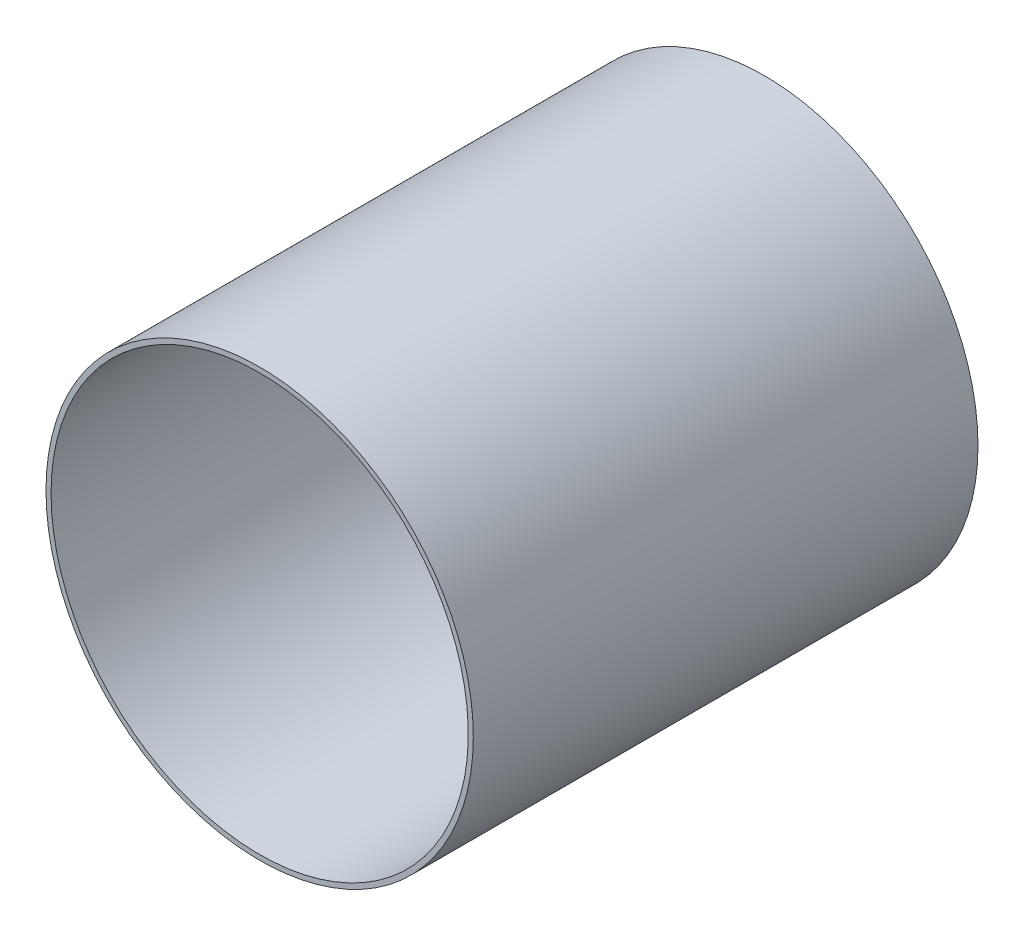
ISO-10303-21;
HEADER;
FILE_DESCRIPTION(('STEP AP214'),'2;1');
FILE_NAME('part.step','',(''),(''),'','','');
FILE_SCHEMA(('AUTOMOTIVE_DESIGN { 1 0 10303 214 1 1 1 1 }'));
ENDSEC;
DATA;
#1=APPLICATION_CONTEXT('core data for automotive mechanical design processes');
#2=APPLICATION_PROTOCOL_DEFINITION('international standard','automotive_design',2000,#1);
#3=PRODUCT_CONTEXT('',#1,'mechanical');
#4=PRODUCT('Part','Part','',(#3));
#5=PRODUCT_RELATED_PRODUCT_CATEGORY('part','',(#4));
#6=PRODUCT_DEFINITION_FORMATION('','',#4);
#7=PRODUCT_DEFINITION_CONTEXT('part definition',#1,'design');
#8=PRODUCT_DEFINITION('design','',#6,#7);
#9=PRODUCT_DEFINITION_SHAPE('','',#8);
#10=(LENGTH_UNIT() NAMED_UNIT(*) SI_UNIT(.MILLI.,.METRE.));
#11=(NAMED_UNIT(*) PLANE_ANGLE_UNIT() SI_UNIT($,.RADIAN.));
#12=(NAMED_UNIT(*) SI_UNIT($,.STERADIAN.) SOLID_ANGLE_UNIT());
#13=UNCERTAINTY_MEASURE_WITH_UNIT(LENGTH_MEASURE(1.E-05),#10,'distance_accuracy_value','');
#14=(GEOMETRIC_REPRESENTATION_CONTEXT(3) GLOBAL_UNCERTAINTY_ASSIGNED_CONTEXT((#13)) GLOBAL_UNIT_ASSIGNED_CONTEXT((#10,
#11,#12)) REPRESENTATION_CONTEXT('',''));
#15=CARTESIAN_POINT('',(0.,0.,0.));
#16=DIRECTION('',(0.,0.,1.));
#17=DIRECTION('',(1.,0.,0.));
#18=AXIS2_PLACEMENT_3D('',#15,#16,#17);
#19=CARTESIAN_POINT('',(0.,0.,76.2));
#20=DIRECTION('',(0.,0.,1.));
#21=DIRECTION('',(1.,0.,0.));
#22=AXIS2_PLACEMENT_3D('',#19,#20,#21);
#23=PLANE('',#22);
#24=CARTESIAN_POINT('',(0.,0.,76.2));
#25=DIRECTION('',(0.,0.,1.));
#26=DIRECTION('',(1.,0.,0.));
#27=AXIS2_PLACEMENT_3D('',#24,#25,#26);
#28=CIRCLE('',#27,32.258);
#29=CARTESIAN_POINT('',(-32.258,0.,76.2));
#30=VERTEX_POINT('',#29);
#31=EDGE_CURVE('E10',#30,#30,#28,.T.);
#32=ORIENTED_EDGE('',*,*,#31,.T.);
#33=EDGE_LOOP('',(#32));
#34=FACE_BOUND('',#33,.T.);
#35=CARTESIAN_POINT('',(0.,0.,76.2));
#36=DIRECTION('',(0.,0.,1.));
#37=DIRECTION('',(1.,0.,0.));
#38=AXIS2_PLACEMENT_3D('',#35,#36,#37);
#39=CIRCLE('',#38,31.5);
#40=CARTESIAN_POINT('',(-31.5,0.,76.2));
#41=VERTEX_POINT('',#40);
#42=EDGE_CURVE('E52',#41,#41,#39,.T.);
#43=ORIENTED_EDGE('',*,*,#42,.F.);
#44=EDGE_LOOP('',(#43));
#45=FACE_BOUND('',#44,.T.);
#46=ADVANCED_FACE('F39',(#34,#45),#23,.T.);
#47=CARTESIAN_POINT('',(0.,0.,0.));
#48=DIRECTION('',(0.,0.,1.));
#49=DIRECTION('',(1.,0.,0.));
#50=AXIS2_PLACEMENT_3D('',#47,#48,#49);
#51=PLANE('',#50);
#52=CARTESIAN_POINT('',(0.,0.,0.));
#53=DIRECTION('',(0.,0.,1.));
#54=DIRECTION('',(1.,0.,0.));
#55=AXIS2_PLACEMENT_3D('',#52,#53,#54);
#56=CIRCLE('',#55,32.258);
#57=CARTESIAN_POINT('',(-32.258,0.,0.));
#58=VERTEX_POINT('',#57);
#59=EDGE_CURVE('E43',#58,#58,#56,.T.);
#60=ORIENTED_EDGE('',*,*,#59,.F.);
#61=EDGE_LOOP('',(#60));
#62=FACE_BOUND('',#61,.T.);
#63=CARTESIAN_POINT('',(0.,0.,0.));
#64=DIRECTION('',(0.,0.,1.));
#65=DIRECTION('',(1.,0.,0.));
#66=AXIS2_PLACEMENT_3D('',#63,#64,#65);
#67=CIRCLE('',#66,31.5);
#68=CARTESIAN_POINT('',(-31.5,0.,0.));
#69=VERTEX_POINT('',#68);
#70=EDGE_CURVE('E54',#69,#69,#67,.T.);
#71=ORIENTED_EDGE('',*,*,#70,.T.);
#72=EDGE_LOOP('',(#71));
#73=FACE_BOUND('',#72,.T.);
#74=ADVANCED_FACE('F66',(#62,#73),#51,.F.);
#75=CARTESIAN_POINT('',(0.,0.,76.2));
#76=DIRECTION('',(0.,0.,-1.));
#77=DIRECTION('',(-1.,0.,0.));
#78=AXIS2_PLACEMENT_3D('',#75,#76,#77);
#79=CYLINDRICAL_SURFACE('',#78,32.258);
#80=CARTESIAN_POINT('',(-32.258,0.,76.2));
#81=CARTESIAN_POINT('',(-32.258,0.,75.40625));
#82=CARTESIAN_POINT('',(-32.258,0.,74.6125));
#83=CARTESIAN_POINT('',(-32.258,0.,73.025));
#84=CARTESIAN_POINT('',(-32.258,0.,72.23125));
#85=CARTESIAN_POINT('',(-32.258,0.,70.64375));
#86=CARTESIAN_POINT('',(-32.258,0.,69.85));
#87=CARTESIAN_POINT('',(-32.258,0.,68.2625));
#88=CARTESIAN_POINT('',(-32.258,0.,67.46875));
#89=CARTESIAN_POINT('',(-32.258,0.,65.88125));
#90=CARTESIAN_POINT('',(-32.258,0.,65.0875));
#91=CARTESIAN_POINT('',(-32.258,0.,63.5));
#92=CARTESIAN_POINT('',(-32.258,0.,62.70625));
#93=CARTESIAN_POINT('',(-32.258,0.,61.11875));
#94=CARTESIAN_POINT('',(-32.258,0.,60.325));
#95=CARTESIAN_POINT('',(-32.258,0.,58.7375));
#96=CARTESIAN_POINT('',(-32.258,0.,57.94375));
#97=CARTESIAN_POINT('',(-32.258,0.,56.35625));
#98=CARTESIAN_POINT('',(-32.258,0.,55.5625));
#99=CARTESIAN_POINT('',(-32.258,0.,53.975));
#100=CARTESIAN_POINT('',(-32.258,0.,53.18125));
#101=CARTESIAN_POINT('',(-32.258,0.,51.59375));
#102=CARTESIAN_POINT('',(-32.258,0.,50.8));
#103=CARTESIAN_POINT('',(-32.258,0.,49.2125));
#104=CARTESIAN_POINT('',(-32.258,0.,48.41875));
#105=CARTESIAN_POINT('',(-32.258,0.,46.83125));
#106=CARTESIAN_POINT('',(-32.258,0.,46.0375));
#107=CARTESIAN_POINT('',(-32.258,0.,44.45));
#108=CARTESIAN_POINT('',(-32.258,0.,43.65625));
#109=CARTESIAN_POINT('',(-32.258,0.,42.06875));
#110=CARTESIAN_POINT('',(-32.258,0.,41.275));
#111=CARTESIAN_POINT('',(-32.258,0.,39.6875));
#112=CARTESIAN_POINT('',(-32.258,0.,38.89375));
#113=CARTESIAN_POINT('',(-32.258,0.,37.30625));
#114=CARTESIAN_POINT('',(-32.258,0.,36.5125));
#115=CARTESIAN_POINT('',(-32.258,0.,34.925));
#116=CARTESIAN_POINT('',(-32.258,0.,34.13125));
#117=CARTESIAN_POINT('',(-32.258,0.,32.54375));
#118=CARTESIAN_POINT('',(-32.258,0.,31.75));
#119=CARTESIAN_POINT('',(-32.258,0.,30.1625));
#120=CARTESIAN_POINT('',(-32.258,0.,29.36875));
#121=CARTESIAN_POINT('',(-32.258,0.,27.78125));
#122=CARTESIAN_POINT('',(-32.258,0.,26.9875));
#123=CARTESIAN_POINT('',(-32.258,0.,25.4));
#124=CARTESIAN_POINT('',(-32.258,0.,24.60625));
#125=CARTESIAN_POINT('',(-32.258,0.,23.01875));
#126=CARTESIAN_POINT('',(-32.258,0.,22.225));
#127=CARTESIAN_POINT('',(-32.258,0.,20.6375));
#128=CARTESIAN_POINT('',(-32.258,0.,19.84375));
#129=CARTESIAN_POINT('',(-32.258,0.,18.25625));
#130=CARTESIAN_POINT('',(-32.258,0.,17.4625));
#131=CARTESIAN_POINT('',(-32.258,0.,15.875));
#132=CARTESIAN_POINT('',(-32.258,0.,15.08125));
#133=CARTESIAN_POINT('',(-32.258,0.,13.49375));
#134=CARTESIAN_POINT('',(-32.258,0.,12.7));
#135=CARTESIAN_POINT('',(-32.258,0.,11.1125));
#136=CARTESIAN_POINT('',(-32.258,0.,10.31875));
#137=CARTESIAN_POINT('',(-32.258,0.,8.73125));
#138=CARTESIAN_POINT('',(-32.258,0.,7.93750000000001));
#139=CARTESIAN_POINT('',(-32.258,0.,6.35));
#140=CARTESIAN_POINT('',(-32.258,0.,5.55625));
#141=CARTESIAN_POINT('',(-32.258,0.,3.96875));
#142=CARTESIAN_POINT('',(-32.258,0.,3.175));
#143=CARTESIAN_POINT('',(-32.258,0.,1.5875));
#144=CARTESIAN_POINT('',(-32.258,0.,0.793750000000001));
#145=CARTESIAN_POINT('',(-32.258,0.,0.));
#146=B_SPLINE_CURVE_WITH_KNOTS('',3,(#80,#81,#82,#83,#84,#85,#86,#87,#88,#89,#90,#91,#92,#93,
#94,#95,#96,#97,#98,#99,#100,#101,#102,#103,#104,#105,#106,#107,#108,#109,#110,#111,#112,#113,
#114,#115,#116,#117,#118,#119,#120,#121,#122,#123,#124,#125,#126,#127,#128,#129,#130,#131,#132,
#133,#134,#135,#136,#137,#138,#139,#140,#141,#142,#143,#144,#145),.UNSPECIFIED.,.F.,.F.,(4,2,2,
2,2,2,2,2,2,2,2,2,2,2,2,2,2,2,2,2,2,2,2,2,2,2,2,2,2,2,2,2,4),(0.,2.38124999999999,
4.76249999999999,7.14374999999999,9.52499999999999,11.90625,14.2875,16.66875,19.05,21.43125,
23.8125,26.19375,28.575,30.95625,33.3375,35.71875,38.1,40.48125,42.8625,45.24375,47.625,
50.00625,52.3875,54.76875,57.15,59.53125,61.9125,64.29375,66.675,69.05625,71.4375,73.81875,
76.2),.UNSPECIFIED.);
#147=EDGE_CURVE('BSEAM41',#30,#58,#146,.T.);
#148=ORIENTED_EDGE('',*,*,#31,.F.);
#149=ORIENTED_EDGE('',*,*,#59,.T.);
#150=ORIENTED_EDGE('',*,*,#147,.T.);
#151=ORIENTED_EDGE('',*,*,#147,.F.);
#152=EDGE_LOOP('',(#148,#150,#149,#151));
#153=FACE_BOUND('',#152,.T.);
#154=ADVANCED_FACE('F41',(#153),#79,.T.);
#155=CARTESIAN_POINT('',(0.,0.,76.2));
#156=DIRECTION('',(0.,0.,-1.));
#157=DIRECTION('',(-1.,0.,0.));
#158=AXIS2_PLACEMENT_3D('',#155,#156,#157);
#159=CYLINDRICAL_SURFACE('',#158,31.5);
#160=CARTESIAN_POINT('',(-31.5,0.,76.2));
#161=CARTESIAN_POINT('',(-31.5,0.,75.40625));
#162=CARTESIAN_POINT('',(-31.5,0.,74.6125));
#163=CARTESIAN_POINT('',(-31.5,0.,73.025));
#164=CARTESIAN_POINT('',(-31.5,0.,72.23125));
#165=CARTESIAN_POINT('',(-31.5,0.,70.64375));
#166=CARTESIAN_POINT('',(-31.5,0.,69.85));
#167=CARTESIAN_POINT('',(-31.5,0.,68.2625));
#168=CARTESIAN_POINT('',(-31.5,0.,67.46875));
#169=CARTESIAN_POINT('',(-31.5,0.,65.88125));
#170=CARTESIAN_POINT('',(-31.5,0.,65.0875));
#171=CARTESIAN_POINT('',(-31.5,0.,63.5));
#172=CARTESIAN_POINT('',(-31.5,0.,62.70625));
#173=CARTESIAN_POINT('',(-31.5,0.,61.11875));
#174=CARTESIAN_POINT('',(-31.5,0.,60.325));
#175=CARTESIAN_POINT('',(-31.5,0.,58.7375));
#176=CARTESIAN_POINT('',(-31.5,0.,57.94375));
#177=CARTESIAN_POINT('',(-31.5,0.,56.35625));
#178=CARTESIAN_POINT('',(-31.5,0.,55.5625));
#179=CARTESIAN_POINT('',(-31.5,0.,53.975));
#180=CARTESIAN_POINT('',(-31.5,0.,53.18125));
#181=CARTESIAN_POINT('',(-31.5,0.,51.59375));
#182=CARTESIAN_POINT('',(-31.5,0.,50.8));
#183=CARTESIAN_POINT('',(-31.5,0.,49.2125));
#184=CARTESIAN_POINT('',(-31.5,0.,48.41875));
#185=CARTESIAN_POINT('',(-31.5,0.,46.83125));
#186=CARTESIAN_POINT('',(-31.5,0.,46.0375));
#187=CARTESIAN_POINT('',(-31.5,0.,44.45));
#188=CARTESIAN_POINT('',(-31.5,0.,43.65625));
#189=CARTESIAN_POINT('',(-31.5,0.,42.06875));
#190=CARTESIAN_POINT('',(-31.5,0.,41.275));
#191=CARTESIAN_POINT('',(-31.5,0.,39.6875));
#192=CARTESIAN_POINT('',(-31.5,0.,38.89375));
#193=CARTESIAN_POINT('',(-31.5,0.,37.30625));
#194=CARTESIAN_POINT('',(-31.5,0.,36.5125));
#195=CARTESIAN_POINT('',(-31.5,0.,34.925));
#196=CARTESIAN_POINT('',(-31.5,0.,34.13125));
#197=CARTESIAN_POINT('',(-31.5,0.,32.54375));
#198=CARTESIAN_POINT('',(-31.5,0.,31.75));
#199=CARTESIAN_POINT('',(-31.5,0.,30.1625));
#200=CARTESIAN_POINT('',(-31.5,0.,29.36875));
#201=CARTESIAN_POINT('',(-31.5,0.,27.78125));
#202=CARTESIAN_POINT('',(-31.5,0.,26.9875));
#203=CARTESIAN_POINT('',(-31.5,0.,25.4));
#204=CARTESIAN_POINT('',(-31.5,0.,24.60625));
#205=CARTESIAN_POINT('',(-31.5,0.,23.01875));
#206=CARTESIAN_POINT('',(-31.5,0.,22.225));
#207=CARTESIAN_POINT('',(-31.5,0.,20.6375));
#208=CARTESIAN_POINT('',(-31.5,0.,19.84375));
#209=CARTESIAN_POINT('',(-31.5,0.,18.25625));
#210=CARTESIAN_POINT('',(-31.5,0.,17.4625));
#211=CARTESIAN_POINT('',(-31.5,0.,15.875));
#212=CARTESIAN_POINT('',(-31.5,0.,15.08125));
#213=CARTESIAN_POINT('',(-31.5,0.,13.49375));
#214=CARTESIAN_POINT('',(-31.5,0.,12.7));
#215=CARTESIAN_POINT('',(-31.5,0.,11.1125));
#216=CARTESIAN_POINT('',(-31.5,0.,10.31875));
#217=CARTESIAN_POINT('',(-31.5,0.,8.73125));
#218=CARTESIAN_POINT('',(-31.5,0.,7.93750000000001));
#219=CARTESIAN_POINT('',(-31.5,0.,6.35));
#220=CARTESIAN_POINT('',(-31.5,0.,5.55625));
#221=CARTESIAN_POINT('',(-31.5,0.,3.96875));
#222=CARTESIAN_POINT('',(-31.5,0.,3.175));
#223=CARTESIAN_POINT('',(-31.5,0.,1.5875));
#224=CARTESIAN_POINT('',(-31.5,0.,0.793750000000001));
#225=CARTESIAN_POINT('',(-31.5,0.,0.));
#226=B_SPLINE_CURVE_WITH_KNOTS('',3,(#160,#161,#162,#163,#164,#165,#166,#167,#168,#169,#170,
#171,#172,#173,#174,#175,#176,#177,#178,#179,#180,#181,#182,#183,#184,#185,#186,#187,#188,#189,
#190,#191,#192,#193,#194,#195,#196,#197,#198,#199,#200,#201,#202,#203,#204,#205,#206,#207,#208,
#209,#210,#211,#212,#213,#214,#215,#216,#217,#218,#219,#220,#221,#222,#223,#224,#225),
.UNSPECIFIED.,.F.,.F.,(4,2,2,2,2,2,2,2,2,2,2,2,2,2,2,2,2,2,2,2,2,2,2,2,2,2,2,2,2,2,2,2,4),(0.,
2.38125,4.7625,7.14375,9.52500000000001,11.90625,14.2875,16.66875,19.05,21.43125,23.8125,
26.19375,28.575,30.95625,33.3375,35.71875,38.1,40.48125,42.8625,45.24375,47.625,50.00625,
52.3875,54.76875,57.15,59.53125,61.9125,64.29375,66.675,69.05625,71.4375,73.81875,76.2),.UNSPECIFIED.);
#227=EDGE_CURVE('BSEAM62',#41,#69,#226,.T.);
#228=ORIENTED_EDGE('',*,*,#42,.T.);
#229=ORIENTED_EDGE('',*,*,#70,.F.);
#230=ORIENTED_EDGE('',*,*,#227,.T.);
#231=ORIENTED_EDGE('',*,*,#227,.F.);
#232=EDGE_LOOP('',(#228,#230,#229,#231));
#233=FACE_BOUND('',#232,.T.);
#234=ADVANCED_FACE('F62',(#233),#159,.F.);
#235=CLOSED_SHELL('',(#46,#74,#154,#234));
#236=MANIFOLD_SOLID_BREP('B2',#235);
#237=ADVANCED_BREP_SHAPE_REPRESENTATION('',(#18,#236),#14);
#238=SHAPE_DEFINITION_REPRESENTATION(#9,#237);
ENDSEC;
END-ISO-10303-21;
